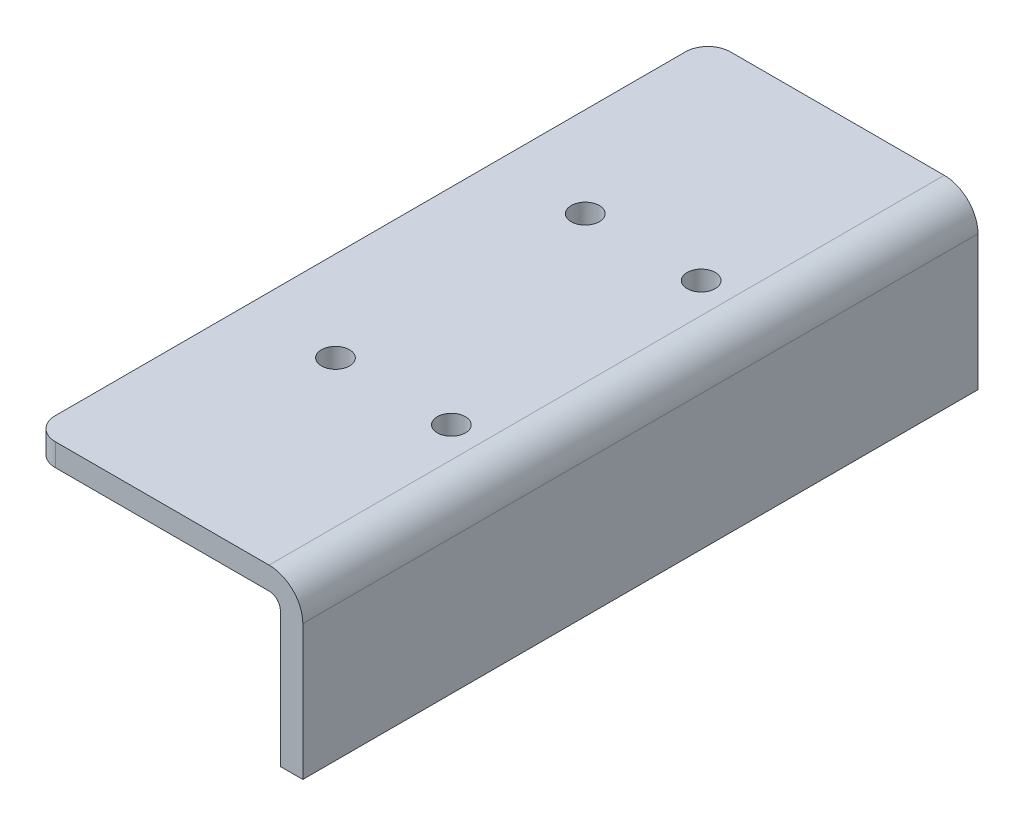
ISO-10303-21;
HEADER;
FILE_DESCRIPTION(('STEP AP214'),'2;1');
FILE_NAME('part.step','',(''),(''),'','','');
FILE_SCHEMA(('AUTOMOTIVE_DESIGN { 1 0 10303 214 1 1 1 1 }'));
ENDSEC;
DATA;
#1=APPLICATION_CONTEXT('core data for automotive mechanical design processes');
#2=APPLICATION_PROTOCOL_DEFINITION('international standard','automotive_design',2000,#1);
#3=PRODUCT_CONTEXT('',#1,'mechanical');
#4=PRODUCT('Part','Part','',(#3));
#5=PRODUCT_RELATED_PRODUCT_CATEGORY('part','',(#4));
#6=PRODUCT_DEFINITION_FORMATION('','',#4);
#7=PRODUCT_DEFINITION_CONTEXT('part definition',#1,'design');
#8=PRODUCT_DEFINITION('design','',#6,#7);
#9=PRODUCT_DEFINITION_SHAPE('','',#8);
#10=(LENGTH_UNIT() NAMED_UNIT(*) SI_UNIT(.MILLI.,.METRE.));
#11=(NAMED_UNIT(*) PLANE_ANGLE_UNIT() SI_UNIT($,.RADIAN.));
#12=(NAMED_UNIT(*) SI_UNIT($,.STERADIAN.) SOLID_ANGLE_UNIT());
#13=UNCERTAINTY_MEASURE_WITH_UNIT(LENGTH_MEASURE(1.E-05),#10,'distance_accuracy_value','');
#14=(GEOMETRIC_REPRESENTATION_CONTEXT(3) GLOBAL_UNCERTAINTY_ASSIGNED_CONTEXT((#13)) GLOBAL_UNIT_ASSIGNED_CONTEXT((#10,
#11,#12)) REPRESENTATION_CONTEXT('',''));
#15=CARTESIAN_POINT('',(0.,0.,0.));
#16=DIRECTION('',(0.,0.,1.));
#17=DIRECTION('',(1.,0.,0.));
#18=AXIS2_PLACEMENT_3D('',#15,#16,#17);
#19=CARTESIAN_POINT('',(1165.5,-1181.5,-200.000000000001));
#20=DIRECTION('',(0.,0.,1.));
#21=DIRECTION('',(0.,-1.,0.));
#22=AXIS2_PLACEMENT_3D('',#19,#20,#21);
#23=CYLINDRICAL_SURFACE('',#22,0.99999999999989);
#24=DIRECTION('',(0.,0.,1.));
#25=VECTOR('',#24,1.);
#26=CARTESIAN_POINT('',(1166.5,-1181.5,-230.000000000001));
#27=LINE('',#26,#25);
#28=CARTESIAN_POINT('',(1166.5,-1181.5,-200.000000000001));
#29=VERTEX_POINT('',#28);
#30=CARTESIAN_POINT('',(1166.5,-1181.5,-260.000000000001));
#31=VERTEX_POINT('',#30);
#32=EDGE_CURVE('E116',#29,#31,#27,.F.);
#33=ORIENTED_EDGE('',*,*,#32,.F.);
#34=CARTESIAN_POINT('',(1165.5,-1181.5,-200.000000000001));
#35=DIRECTION('',(0.,0.,1.));
#36=DIRECTION('',(0.,-1.,0.));
#37=AXIS2_PLACEMENT_3D('',#34,#35,#36);
#38=CIRCLE('',#37,0.99999999999989);
#39=CARTESIAN_POINT('',(1165.5,-1180.5,-200.000000000001));
#40=VERTEX_POINT('',#39);
#41=EDGE_CURVE('E22',#40,#29,#38,.F.);
#42=ORIENTED_EDGE('',*,*,#41,.F.);
#43=DIRECTION('',(0.,0.,1.));
#44=VECTOR('',#43,1.);
#45=CARTESIAN_POINT('',(1165.5,-1180.5,-230.000000000001));
#46=LINE('',#45,#44);
#47=CARTESIAN_POINT('',(1165.5,-1180.5,-260.000000000001));
#48=VERTEX_POINT('',#47);
#49=EDGE_CURVE('E146',#48,#40,#46,.T.);
#50=ORIENTED_EDGE('',*,*,#49,.F.);
#51=CARTESIAN_POINT('',(1165.5,-1181.5,-260.000000000001));
#52=DIRECTION('',(0.,0.,1.));
#53=DIRECTION('',(0.,-1.,0.));
#54=AXIS2_PLACEMENT_3D('',#51,#52,#53);
#55=CIRCLE('',#54,0.99999999999989);
#56=EDGE_CURVE('E163',#31,#48,#55,.T.);
#57=ORIENTED_EDGE('',*,*,#56,.F.);
#58=EDGE_LOOP('',(#33,#42,#50,#57));
#59=FACE_BOUND('',#58,.T.);
#60=ADVANCED_FACE('F19',(#59),#23,.F.);
#61=CARTESIAN_POINT('',(1166.5,-1178.5,-230.000000000001));
#62=DIRECTION('',(-1.,0.,0.));
#63=DIRECTION('',(0.,-1.,0.));
#64=AXIS2_PLACEMENT_3D('',#61,#62,#63);
#65=PLANE('',#64);
#66=DIRECTION('',(0.,1.,0.));
#67=VECTOR('',#66,1.);
#68=CARTESIAN_POINT('',(1166.5,-1180.5,-200.000000000001));
#69=LINE('',#68,#67);
#70=CARTESIAN_POINT('',(1166.5,-1193.5,-200.000000000001));
#71=VERTEX_POINT('',#70);
#72=EDGE_CURVE('E94',#29,#71,#69,.F.);
#73=ORIENTED_EDGE('',*,*,#72,.F.);
#74=ORIENTED_EDGE('',*,*,#32,.T.);
#75=DIRECTION('',(0.,1.,0.));
#76=VECTOR('',#75,1.);
#77=CARTESIAN_POINT('',(1166.5,-1180.5,-260.000000000001));
#78=LINE('',#77,#76);
#79=CARTESIAN_POINT('',(1166.5,-1193.5,-260.000000000001));
#80=VERTEX_POINT('',#79);
#81=EDGE_CURVE('E121',#80,#31,#78,.T.);
#82=ORIENTED_EDGE('',*,*,#81,.F.);
#83=DIRECTION('',(0.,0.,1.));
#84=VECTOR('',#83,1.);
#85=CARTESIAN_POINT('',(1166.5,-1193.5,-260.000000000001));
#86=LINE('',#85,#84);
#87=EDGE_CURVE('E109',#80,#71,#86,.T.);
#88=ORIENTED_EDGE('',*,*,#87,.T.);
#89=EDGE_LOOP('',(#73,#74,#82,#88));
#90=FACE_BOUND('',#89,.T.);
#91=ADVANCED_FACE('F126',(#90),#65,.T.);
#92=CARTESIAN_POINT('',(1168.5,-1193.5,-260.000000000001));
#93=DIRECTION('',(0.,1.,0.));
#94=DIRECTION('',(-1.,0.,0.));
#95=AXIS2_PLACEMENT_3D('',#92,#93,#94);
#96=PLANE('',#95);
#97=DIRECTION('',(0.,0.,1.));
#98=VECTOR('',#97,1.);
#99=CARTESIAN_POINT('',(1168.5,-1193.5,-230.000000000001));
#100=LINE('',#99,#98);
#101=CARTESIAN_POINT('',(1168.5,-1193.5,-260.000000000001));
#102=VERTEX_POINT('',#101);
#103=CARTESIAN_POINT('',(1168.5,-1193.5,-200.000000000001));
#104=VERTEX_POINT('',#103);
#105=EDGE_CURVE('E103',#102,#104,#100,.T.);
#106=ORIENTED_EDGE('',*,*,#105,.T.);
#107=DIRECTION('',(1.,0.,0.));
#108=VECTOR('',#107,1.);
#109=CARTESIAN_POINT('',(1144.5,-1193.5,-200.000000000001));
#110=LINE('',#109,#108);
#111=EDGE_CURVE('E113',#71,#104,#110,.T.);
#112=ORIENTED_EDGE('',*,*,#111,.F.);
#113=ORIENTED_EDGE('',*,*,#87,.F.);
#114=DIRECTION('',(-1.,0.,0.));
#115=VECTOR('',#114,1.);
#116=CARTESIAN_POINT('',(1144.5,-1193.5,-260.000000000001));
#117=LINE('',#116,#115);
#118=EDGE_CURVE('E112',#102,#80,#117,.T.);
#119=ORIENTED_EDGE('',*,*,#118,.F.);
#120=EDGE_LOOP('',(#106,#112,#113,#119));
#121=FACE_BOUND('',#120,.T.);
#122=ADVANCED_FACE('F111',(#121),#96,.F.);
#123=CARTESIAN_POINT('',(1168.5,-1178.5,-230.000000000001));
#124=DIRECTION('',(-1.,0.,0.));
#125=DIRECTION('',(0.,-1.,0.));
#126=AXIS2_PLACEMENT_3D('',#123,#124,#125);
#127=PLANE('',#126);
#128=ORIENTED_EDGE('',*,*,#105,.F.);
#129=DIRECTION('',(0.,1.,0.));
#130=VECTOR('',#129,1.);
#131=CARTESIAN_POINT('',(1168.5,-1180.5,-260.000000000001));
#132=LINE('',#131,#130);
#133=CARTESIAN_POINT('',(1168.5,-1181.5,-260.000000000001));
#134=VERTEX_POINT('',#133);
#135=EDGE_CURVE('E123',#134,#102,#132,.F.);
#136=ORIENTED_EDGE('',*,*,#135,.F.);
#137=DIRECTION('',(0.,0.,1.));
#138=VECTOR('',#137,1.);
#139=CARTESIAN_POINT('',(1168.5,-1181.5,-200.000000000001));
#140=LINE('',#139,#138);
#141=CARTESIAN_POINT('',(1168.5,-1181.5,-200.000000000001));
#142=VERTEX_POINT('',#141);
#143=EDGE_CURVE('E140',#142,#134,#140,.F.);
#144=ORIENTED_EDGE('',*,*,#143,.F.);
#145=DIRECTION('',(0.,1.,0.));
#146=VECTOR('',#145,1.);
#147=CARTESIAN_POINT('',(1168.5,-1180.5,-200.000000000001));
#148=LINE('',#147,#146);
#149=EDGE_CURVE('E157',#104,#142,#148,.T.);
#150=ORIENTED_EDGE('',*,*,#149,.F.);
#151=EDGE_LOOP('',(#128,#136,#144,#150));
#152=FACE_BOUND('',#151,.T.);
#153=ADVANCED_FACE('F248',(#152),#127,.F.);
#154=CARTESIAN_POINT('',(1155.5,-1180.5,-230.000000000001));
#155=DIRECTION('',(0.,-1.,0.));
#156=DIRECTION('',(1.,0.,0.));
#157=AXIS2_PLACEMENT_3D('',#154,#155,#156);
#158=PLANE('',#157);
#159=CARTESIAN_POINT('',(1162.8,-1180.5,-241.100000000001));
#160=DIRECTION('',(0.,1.,0.));
#161=DIRECTION('',(-1.,0.,0.));
#162=AXIS2_PLACEMENT_3D('',#159,#160,#161);
#163=CIRCLE('',#162,1.24999999999997);
#164=CARTESIAN_POINT('',(1161.55,-1180.5,-241.100000000001));
#165=VERTEX_POINT('',#164);
#166=EDGE_CURVE('E183',#165,#165,#163,.T.);
#167=ORIENTED_EDGE('',*,*,#166,.T.);
#168=EDGE_LOOP('',(#167));
#169=FACE_BOUND('',#168,.T.);
#170=CARTESIAN_POINT('',(1152.5,-1180.5,-218.900000000001));
#171=DIRECTION('',(0.,1.,0.));
#172=DIRECTION('',(-1.,0.,0.));
#173=AXIS2_PLACEMENT_3D('',#170,#171,#172);
#174=CIRCLE('',#173,1.24999999999997);
#175=CARTESIAN_POINT('',(1151.25,-1180.5,-218.900000000001));
#176=VERTEX_POINT('',#175);
#177=EDGE_CURVE('E187',#176,#176,#174,.T.);
#178=ORIENTED_EDGE('',*,*,#177,.T.);
#179=EDGE_LOOP('',(#178));
#180=FACE_BOUND('',#179,.T.);
#181=CARTESIAN_POINT('',(1152.5,-1180.5,-241.100000000001));
#182=DIRECTION('',(0.,1.,0.));
#183=DIRECTION('',(-1.,0.,0.));
#184=AXIS2_PLACEMENT_3D('',#181,#182,#183);
#185=CIRCLE('',#184,1.24999999999997);
#186=CARTESIAN_POINT('',(1151.25,-1180.5,-241.100000000001));
#187=VERTEX_POINT('',#186);
#188=EDGE_CURVE('E190',#187,#187,#185,.T.);
#189=ORIENTED_EDGE('',*,*,#188,.T.);
#190=EDGE_LOOP('',(#189));
#191=FACE_BOUND('',#190,.T.);
#192=CARTESIAN_POINT('',(1162.8,-1180.5,-218.900000000001));
#193=DIRECTION('',(0.,1.,0.));
#194=DIRECTION('',(-1.,0.,0.));
#195=AXIS2_PLACEMENT_3D('',#192,#193,#194);
#196=CIRCLE('',#195,1.24999999999997);
#197=CARTESIAN_POINT('',(1161.55,-1180.5,-218.900000000001));
#198=VERTEX_POINT('',#197);
#199=EDGE_CURVE('E193',#198,#198,#196,.T.);
#200=ORIENTED_EDGE('',*,*,#199,.T.);
#201=EDGE_LOOP('',(#200));
#202=FACE_BOUND('',#201,.T.);
#203=DIRECTION('',(0.,0.,1.));
#204=VECTOR('',#203,1.);
#205=CARTESIAN_POINT('',(1144.5,-1180.5,-260.000000000001));
#206=LINE('',#205,#204);
#207=CARTESIAN_POINT('',(1144.5,-1180.5,-258.000000000001));
#208=VERTEX_POINT('',#207);
#209=CARTESIAN_POINT('',(1144.5,-1180.5,-202.000000000001));
#210=VERTEX_POINT('',#209);
#211=EDGE_CURVE('E143',#208,#210,#206,.T.);
#212=ORIENTED_EDGE('',*,*,#211,.F.);
#213=CARTESIAN_POINT('',(1146.5,-1180.5,-258.000000000001));
#214=DIRECTION('',(0.,1.,0.));
#215=DIRECTION('',(-1.,0.,0.));
#216=AXIS2_PLACEMENT_3D('',#213,#214,#215);
#217=CIRCLE('',#216,2.);
#218=CARTESIAN_POINT('',(1146.5,-1180.5,-260.000000000001));
#219=VERTEX_POINT('',#218);
#220=EDGE_CURVE('E142',#219,#208,#217,.T.);
#221=ORIENTED_EDGE('',*,*,#220,.F.);
#222=DIRECTION('',(-1.,0.,0.));
#223=VECTOR('',#222,1.);
#224=CARTESIAN_POINT('',(1144.5,-1180.5,-260.000000000001));
#225=LINE('',#224,#223);
#226=EDGE_CURVE('E127',#48,#219,#225,.T.);
#227=ORIENTED_EDGE('',*,*,#226,.F.);
#228=ORIENTED_EDGE('',*,*,#49,.T.);
#229=DIRECTION('',(1.,0.,0.));
#230=VECTOR('',#229,1.);
#231=CARTESIAN_POINT('',(1144.5,-1180.5,-200.000000000001));
#232=LINE('',#231,#230);
#233=CARTESIAN_POINT('',(1146.5,-1180.5,-200.000000000001));
#234=VERTEX_POINT('',#233);
#235=EDGE_CURVE('E203',#234,#40,#232,.T.);
#236=ORIENTED_EDGE('',*,*,#235,.F.);
#237=CARTESIAN_POINT('',(1146.5,-1180.5,-202.000000000001));
#238=DIRECTION('',(0.,1.,0.));
#239=DIRECTION('',(-1.,0.,0.));
#240=AXIS2_PLACEMENT_3D('',#237,#238,#239);
#241=CIRCLE('',#240,2.);
#242=EDGE_CURVE('E196',#210,#234,#241,.T.);
#243=ORIENTED_EDGE('',*,*,#242,.F.);
#244=EDGE_LOOP('',(#212,#221,#227,#228,#236,#243));
#245=FACE_BOUND('',#244,.T.);
#246=ADVANCED_FACE('F209',(#169,#180,#191,#202,#245),#158,.T.);
#247=CARTESIAN_POINT('',(1144.5,-1180.5,-260.000000000001));
#248=DIRECTION('',(-1.,0.,0.));
#249=DIRECTION('',(0.,-1.,0.));
#250=AXIS2_PLACEMENT_3D('',#247,#248,#249);
#251=PLANE('',#250);
#252=ORIENTED_EDGE('',*,*,#211,.T.);
#253=DIRECTION('',(0.,1.,0.));
#254=VECTOR('',#253,1.);
#255=CARTESIAN_POINT('',(1144.5,-1180.5,-202.000000000001));
#256=LINE('',#255,#254);
#257=CARTESIAN_POINT('',(1144.5,-1178.5,-202.000000000001));
#258=VERTEX_POINT('',#257);
#259=EDGE_CURVE('E198',#258,#210,#256,.F.);
#260=ORIENTED_EDGE('',*,*,#259,.F.);
#261=DIRECTION('',(0.,0.,1.));
#262=VECTOR('',#261,1.);
#263=CARTESIAN_POINT('',(1144.5,-1178.5,-230.000000000001));
#264=LINE('',#263,#262);
#265=CARTESIAN_POINT('',(1144.5,-1178.5,-258.000000000001));
#266=VERTEX_POINT('',#265);
#267=EDGE_CURVE('E182',#258,#266,#264,.F.);
#268=ORIENTED_EDGE('',*,*,#267,.T.);
#269=DIRECTION('',(0.,1.,0.));
#270=VECTOR('',#269,1.);
#271=CARTESIAN_POINT('',(1144.5,-1180.5,-258.000000000001));
#272=LINE('',#271,#270);
#273=EDGE_CURVE('E136',#208,#266,#272,.T.);
#274=ORIENTED_EDGE('',*,*,#273,.F.);
#275=EDGE_LOOP('',(#252,#260,#268,#274));
#276=FACE_BOUND('',#275,.T.);
#277=ADVANCED_FACE('F243',(#276),#251,.T.);
#278=CARTESIAN_POINT('',(1146.5,-1180.5,-258.000000000001));
#279=DIRECTION('',(0.,1.,0.));
#280=DIRECTION('',(-1.,0.,0.));
#281=AXIS2_PLACEMENT_3D('',#278,#279,#280);
#282=CYLINDRICAL_SURFACE('',#281,2.);
#283=ORIENTED_EDGE('',*,*,#220,.T.);
#284=ORIENTED_EDGE('',*,*,#273,.T.);
#285=CARTESIAN_POINT('',(1146.5,-1178.5,-258.000000000001));
#286=DIRECTION('',(0.,1.,0.));
#287=DIRECTION('',(-1.,0.,0.));
#288=AXIS2_PLACEMENT_3D('',#285,#286,#287);
#289=CIRCLE('',#288,2.);
#290=CARTESIAN_POINT('',(1146.5,-1178.5,-260.000000000001));
#291=VERTEX_POINT('',#290);
#292=EDGE_CURVE('E179',#266,#291,#289,.F.);
#293=ORIENTED_EDGE('',*,*,#292,.T.);
#294=DIRECTION('',(0.,1.,0.));
#295=VECTOR('',#294,1.);
#296=CARTESIAN_POINT('',(1146.5,-1180.5,-260.000000000001));
#297=LINE('',#296,#295);
#298=EDGE_CURVE('E129',#219,#291,#297,.T.);
#299=ORIENTED_EDGE('',*,*,#298,.F.);
#300=EDGE_LOOP('',(#283,#284,#293,#299));
#301=FACE_BOUND('',#300,.T.);
#302=ADVANCED_FACE('F214',(#301),#282,.T.);
#303=CARTESIAN_POINT('',(1144.5,-1180.5,-260.000000000001));
#304=DIRECTION('',(0.,0.,-1.));
#305=DIRECTION('',(-1.,0.,0.));
#306=AXIS2_PLACEMENT_3D('',#303,#304,#305);
#307=PLANE('',#306);
#308=ORIENTED_EDGE('',*,*,#226,.T.);
#309=ORIENTED_EDGE('',*,*,#298,.T.);
#310=DIRECTION('',(1.,0.,0.));
#311=VECTOR('',#310,1.);
#312=CARTESIAN_POINT('',(1155.5,-1178.5,-260.000000000001));
#313=LINE('',#312,#311);
#314=CARTESIAN_POINT('',(1165.5,-1178.5,-260.000000000001));
#315=VERTEX_POINT('',#314);
#316=EDGE_CURVE('E181',#291,#315,#313,.T.);
#317=ORIENTED_EDGE('',*,*,#316,.T.);
#318=CARTESIAN_POINT('',(1165.5,-1181.5,-260.000000000001));
#319=DIRECTION('',(0.,0.,1.));
#320=DIRECTION('',(0.,-1.,0.));
#321=AXIS2_PLACEMENT_3D('',#318,#319,#320);
#322=CIRCLE('',#321,2.99999999999989);
#323=EDGE_CURVE('E201',#134,#315,#322,.T.);
#324=ORIENTED_EDGE('',*,*,#323,.F.);
#325=ORIENTED_EDGE('',*,*,#135,.T.);
#326=ORIENTED_EDGE('',*,*,#118,.T.);
#327=ORIENTED_EDGE('',*,*,#81,.T.);
#328=ORIENTED_EDGE('',*,*,#56,.T.);
#329=EDGE_LOOP('',(#308,#309,#317,#324,#325,#326,#327,#328));
#330=FACE_BOUND('',#329,.T.);
#331=ADVANCED_FACE('F120',(#330),#307,.T.);
#332=CARTESIAN_POINT('',(1165.5,-1181.5,-200.000000000001));
#333=DIRECTION('',(0.,0.,1.));
#334=DIRECTION('',(0.,-1.,0.));
#335=AXIS2_PLACEMENT_3D('',#332,#333,#334);
#336=CYLINDRICAL_SURFACE('',#335,2.99999999999989);
#337=DIRECTION('',(0.,0.,1.));
#338=VECTOR('',#337,1.);
#339=CARTESIAN_POINT('',(1165.5,-1178.5,-230.000000000001));
#340=LINE('',#339,#338);
#341=CARTESIAN_POINT('',(1165.5,-1178.5,-200.000000000001));
#342=VERTEX_POINT('',#341);
#343=EDGE_CURVE('E224',#315,#342,#340,.T.);
#344=ORIENTED_EDGE('',*,*,#343,.T.);
#345=CARTESIAN_POINT('',(1165.5,-1181.5,-200.000000000001));
#346=DIRECTION('',(0.,0.,1.));
#347=DIRECTION('',(0.,-1.,0.));
#348=AXIS2_PLACEMENT_3D('',#345,#346,#347);
#349=CIRCLE('',#348,2.99999999999989);
#350=EDGE_CURVE('E199',#142,#342,#349,.T.);
#351=ORIENTED_EDGE('',*,*,#350,.F.);
#352=ORIENTED_EDGE('',*,*,#143,.T.);
#353=ORIENTED_EDGE('',*,*,#323,.T.);
#354=EDGE_LOOP('',(#344,#351,#352,#353));
#355=FACE_BOUND('',#354,.T.);
#356=ADVANCED_FACE('F247',(#355),#336,.T.);
#357=CARTESIAN_POINT('',(1144.5,-1180.5,-200.000000000001));
#358=DIRECTION('',(0.,0.,1.));
#359=DIRECTION('',(1.,0.,0.));
#360=AXIS2_PLACEMENT_3D('',#357,#358,#359);
#361=PLANE('',#360);
#362=DIRECTION('',(1.,0.,0.));
#363=VECTOR('',#362,1.);
#364=CARTESIAN_POINT('',(1155.5,-1178.5,-200.000000000001));
#365=LINE('',#364,#363);
#366=CARTESIAN_POINT('',(1146.5,-1178.5,-200.000000000001));
#367=VERTEX_POINT('',#366);
#368=EDGE_CURVE('E178',#342,#367,#365,.F.);
#369=ORIENTED_EDGE('',*,*,#368,.T.);
#370=DIRECTION('',(0.,1.,0.));
#371=VECTOR('',#370,1.);
#372=CARTESIAN_POINT('',(1146.5,-1180.5,-200.000000000001));
#373=LINE('',#372,#371);
#374=EDGE_CURVE('E37',#234,#367,#373,.T.);
#375=ORIENTED_EDGE('',*,*,#374,.F.);
#376=ORIENTED_EDGE('',*,*,#235,.T.);
#377=ORIENTED_EDGE('',*,*,#41,.T.);
#378=ORIENTED_EDGE('',*,*,#72,.T.);
#379=ORIENTED_EDGE('',*,*,#111,.T.);
#380=ORIENTED_EDGE('',*,*,#149,.T.);
#381=ORIENTED_EDGE('',*,*,#350,.T.);
#382=EDGE_LOOP('',(#369,#375,#376,#377,#378,#379,#380,#381));
#383=FACE_BOUND('',#382,.T.);
#384=ADVANCED_FACE('F239',(#383),#361,.T.);
#385=CARTESIAN_POINT('',(1146.5,-1180.5,-202.000000000001));
#386=DIRECTION('',(0.,1.,0.));
#387=DIRECTION('',(-1.,0.,0.));
#388=AXIS2_PLACEMENT_3D('',#385,#386,#387);
#389=CYLINDRICAL_SURFACE('',#388,2.);
#390=ORIENTED_EDGE('',*,*,#242,.T.);
#391=ORIENTED_EDGE('',*,*,#374,.T.);
#392=CARTESIAN_POINT('',(1146.5,-1178.5,-202.000000000001));
#393=DIRECTION('',(0.,1.,0.));
#394=DIRECTION('',(-1.,0.,0.));
#395=AXIS2_PLACEMENT_3D('',#392,#393,#394);
#396=CIRCLE('',#395,2.);
#397=EDGE_CURVE('E176',#367,#258,#396,.F.);
#398=ORIENTED_EDGE('',*,*,#397,.T.);
#399=ORIENTED_EDGE('',*,*,#259,.T.);
#400=EDGE_LOOP('',(#390,#391,#398,#399));
#401=FACE_BOUND('',#400,.T.);
#402=ADVANCED_FACE('F240',(#401),#389,.T.);
#403=CARTESIAN_POINT('',(1162.8,-1178.5,-218.900000000001));
#404=DIRECTION('',(0.,1.,0.));
#405=DIRECTION('',(-1.,0.,0.));
#406=AXIS2_PLACEMENT_3D('',#403,#404,#405);
#407=CYLINDRICAL_SURFACE('',#406,1.24999999999997);
#408=CARTESIAN_POINT('',(1162.8,-1178.5,-218.900000000001));
#409=DIRECTION('',(0.,1.,0.));
#410=DIRECTION('',(-1.,0.,0.));
#411=AXIS2_PLACEMENT_3D('',#408,#409,#410);
#412=CIRCLE('',#411,1.24999999999997);
#413=CARTESIAN_POINT('',(1161.55,-1178.5,-218.900000000001));
#414=VERTEX_POINT('',#413);
#415=EDGE_CURVE('E173',#414,#414,#412,.T.);
#416=ORIENTED_EDGE('',*,*,#415,.T.);
#417=EDGE_LOOP('',(#416));
#418=FACE_BOUND('',#417,.T.);
#419=ORIENTED_EDGE('',*,*,#199,.F.);
#420=EDGE_LOOP('',(#419));
#421=FACE_BOUND('',#420,.T.);
#422=ADVANCED_FACE('F280',(#418,#421),#407,.F.);
#423=CARTESIAN_POINT('',(1152.5,-1178.5,-241.100000000001));
#424=DIRECTION('',(0.,1.,0.));
#425=DIRECTION('',(-1.,0.,0.));
#426=AXIS2_PLACEMENT_3D('',#423,#424,#425);
#427=CYLINDRICAL_SURFACE('',#426,1.24999999999997);
#428=CARTESIAN_POINT('',(1152.5,-1178.5,-241.100000000001));
#429=DIRECTION('',(0.,1.,0.));
#430=DIRECTION('',(-1.,0.,0.));
#431=AXIS2_PLACEMENT_3D('',#428,#429,#430);
#432=CIRCLE('',#431,1.24999999999997);
#433=CARTESIAN_POINT('',(1151.25,-1178.5,-241.100000000001));
#434=VERTEX_POINT('',#433);
#435=EDGE_CURVE('E170',#434,#434,#432,.T.);
#436=ORIENTED_EDGE('',*,*,#435,.T.);
#437=EDGE_LOOP('',(#436));
#438=FACE_BOUND('',#437,.T.);
#439=ORIENTED_EDGE('',*,*,#188,.F.);
#440=EDGE_LOOP('',(#439));
#441=FACE_BOUND('',#440,.T.);
#442=ADVANCED_FACE('F276',(#438,#441),#427,.F.);
#443=CARTESIAN_POINT('',(1152.5,-1178.5,-218.900000000001));
#444=DIRECTION('',(0.,1.,0.));
#445=DIRECTION('',(-1.,0.,0.));
#446=AXIS2_PLACEMENT_3D('',#443,#444,#445);
#447=CYLINDRICAL_SURFACE('',#446,1.24999999999997);
#448=CARTESIAN_POINT('',(1152.5,-1178.5,-218.900000000001));
#449=DIRECTION('',(0.,1.,0.));
#450=DIRECTION('',(-1.,0.,0.));
#451=AXIS2_PLACEMENT_3D('',#448,#449,#450);
#452=CIRCLE('',#451,1.24999999999997);
#453=CARTESIAN_POINT('',(1151.25,-1178.5,-218.900000000001));
#454=VERTEX_POINT('',#453);
#455=EDGE_CURVE('E28',#454,#454,#452,.T.);
#456=ORIENTED_EDGE('',*,*,#455,.T.);
#457=EDGE_LOOP('',(#456));
#458=FACE_BOUND('',#457,.T.);
#459=ORIENTED_EDGE('',*,*,#177,.F.);
#460=EDGE_LOOP('',(#459));
#461=FACE_BOUND('',#460,.T.);
#462=ADVANCED_FACE('F268',(#458,#461),#447,.F.);
#463=CARTESIAN_POINT('',(1162.8,-1178.5,-241.100000000001));
#464=DIRECTION('',(0.,1.,0.));
#465=DIRECTION('',(-1.,0.,0.));
#466=AXIS2_PLACEMENT_3D('',#463,#464,#465);
#467=CYLINDRICAL_SURFACE('',#466,1.24999999999997);
#468=CARTESIAN_POINT('',(1162.8,-1178.5,-241.100000000001));
#469=DIRECTION('',(0.,1.,0.));
#470=DIRECTION('',(-1.,0.,0.));
#471=AXIS2_PLACEMENT_3D('',#468,#469,#470);
#472=CIRCLE('',#471,1.24999999999997);
#473=CARTESIAN_POINT('',(1161.55,-1178.5,-241.100000000001));
#474=VERTEX_POINT('',#473);
#475=EDGE_CURVE('E12',#474,#474,#472,.T.);
#476=ORIENTED_EDGE('',*,*,#475,.T.);
#477=EDGE_LOOP('',(#476));
#478=FACE_BOUND('',#477,.T.);
#479=ORIENTED_EDGE('',*,*,#166,.F.);
#480=EDGE_LOOP('',(#479));
#481=FACE_BOUND('',#480,.T.);
#482=ADVANCED_FACE('F261',(#478,#481),#467,.F.);
#483=CARTESIAN_POINT('',(1155.5,-1178.5,-230.000000000001));
#484=DIRECTION('',(0.,-1.,0.));
#485=DIRECTION('',(1.,0.,0.));
#486=AXIS2_PLACEMENT_3D('',#483,#484,#485);
#487=PLANE('',#486);
#488=ORIENTED_EDGE('',*,*,#475,.F.);
#489=EDGE_LOOP('',(#488));
#490=FACE_BOUND('',#489,.T.);
#491=ORIENTED_EDGE('',*,*,#455,.F.);
#492=EDGE_LOOP('',(#491));
#493=FACE_BOUND('',#492,.T.);
#494=ORIENTED_EDGE('',*,*,#435,.F.);
#495=EDGE_LOOP('',(#494));
#496=FACE_BOUND('',#495,.T.);
#497=ORIENTED_EDGE('',*,*,#415,.F.);
#498=EDGE_LOOP('',(#497));
#499=FACE_BOUND('',#498,.T.);
#500=ORIENTED_EDGE('',*,*,#368,.F.);
#501=ORIENTED_EDGE('',*,*,#343,.F.);
#502=ORIENTED_EDGE('',*,*,#316,.F.);
#503=ORIENTED_EDGE('',*,*,#292,.F.);
#504=ORIENTED_EDGE('',*,*,#267,.F.);
#505=ORIENTED_EDGE('',*,*,#397,.F.);
#506=EDGE_LOOP('',(#500,#501,#502,#503,#504,#505));
#507=FACE_BOUND('',#506,.T.);
#508=ADVANCED_FACE('F221',(#490,#493,#496,#499,#507),#487,.F.);
#509=CLOSED_SHELL('',(#60,#91,#122,#153,#246,#277,#302,#331,#356,#384,#402,#422,#442,#462,#482,#508));
#510=MANIFOLD_SOLID_BREP('B1',#509);
#511=ADVANCED_BREP_SHAPE_REPRESENTATION('',(#18,#510),#14);
#512=SHAPE_DEFINITION_REPRESENTATION(#9,#511);
ENDSEC;
END-ISO-10303-21;
